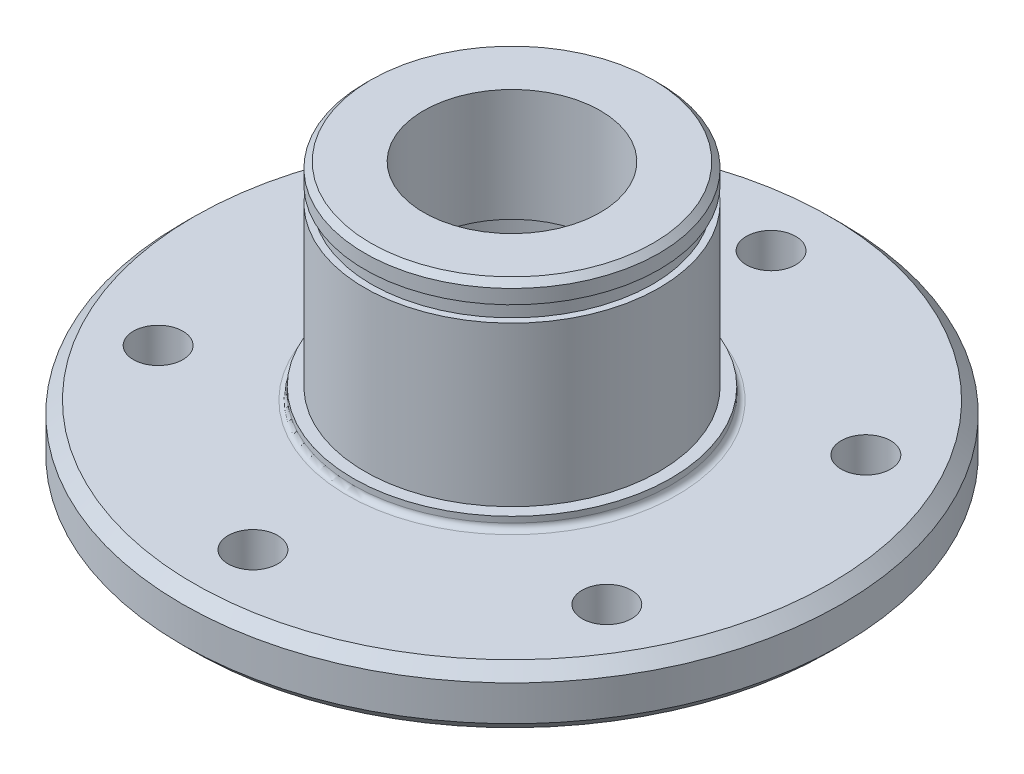
ISO-10303-21;
HEADER;
FILE_DESCRIPTION(('STEP AP214'),'2;1');
FILE_NAME('part.step','',(''),(''),'','','');
FILE_SCHEMA(('AUTOMOTIVE_DESIGN { 1 0 10303 214 1 1 1 1 }'));
ENDSEC;
DATA;
#1=APPLICATION_CONTEXT('core data for automotive mechanical design processes');
#2=APPLICATION_PROTOCOL_DEFINITION('international standard','automotive_design',2000,#1);
#3=PRODUCT_CONTEXT('',#1,'mechanical');
#4=PRODUCT('Part','Part','',(#3));
#5=PRODUCT_RELATED_PRODUCT_CATEGORY('part','',(#4));
#6=PRODUCT_DEFINITION_FORMATION('','',#4);
#7=PRODUCT_DEFINITION_CONTEXT('part definition',#1,'design');
#8=PRODUCT_DEFINITION('design','',#6,#7);
#9=PRODUCT_DEFINITION_SHAPE('','',#8);
#10=(LENGTH_UNIT() NAMED_UNIT(*) SI_UNIT(.MILLI.,.METRE.));
#11=(NAMED_UNIT(*) PLANE_ANGLE_UNIT() SI_UNIT($,.RADIAN.));
#12=(NAMED_UNIT(*) SI_UNIT($,.STERADIAN.) SOLID_ANGLE_UNIT());
#13=UNCERTAINTY_MEASURE_WITH_UNIT(LENGTH_MEASURE(1.E-05),#10,'distance_accuracy_value','');
#14=(GEOMETRIC_REPRESENTATION_CONTEXT(3) GLOBAL_UNCERTAINTY_ASSIGNED_CONTEXT((#13)) GLOBAL_UNIT_ASSIGNED_CONTEXT((#10,
#11,#12)) REPRESENTATION_CONTEXT('',''));
#15=CARTESIAN_POINT('',(0.,0.,0.));
#16=DIRECTION('',(0.,0.,1.));
#17=DIRECTION('',(1.,0.,0.));
#18=AXIS2_PLACEMENT_3D('',#15,#16,#17);
#19=CARTESIAN_POINT('',(0.,0.,0.));
#20=DIRECTION('',(0.,1.,0.));
#21=DIRECTION('',(-1.,0.,0.));
#22=AXIS2_PLACEMENT_3D('',#19,#20,#21);
#23=CYLINDRICAL_SURFACE('',#22,28.);
#24=CARTESIAN_POINT('',(0.,3.99999999999958,0.));
#25=DIRECTION('',(0.,1.,0.));
#26=DIRECTION('',(-1.,0.,0.));
#27=AXIS2_PLACEMENT_3D('',#24,#25,#26);
#28=CIRCLE('',#27,28.);
#29=CARTESIAN_POINT('',(-28.,3.99999999999958,0.));
#30=VERTEX_POINT('',#29);
#31=EDGE_CURVE('E59',#30,#30,#28,.F.);
#32=ORIENTED_EDGE('',*,*,#31,.T.);
#33=EDGE_LOOP('',(#32));
#34=FACE_BOUND('',#33,.T.);
#35=CARTESIAN_POINT('',(0.,1.00000000000043,0.));
#36=DIRECTION('',(0.,-1.,0.));
#37=DIRECTION('',(1.,0.,0.));
#38=AXIS2_PLACEMENT_3D('',#35,#36,#37);
#39=CIRCLE('',#38,28.);
#40=CARTESIAN_POINT('',(-28.,1.00000000000043,0.));
#41=VERTEX_POINT('',#40);
#42=EDGE_CURVE('E62',#41,#41,#39,.F.);
#43=ORIENTED_EDGE('',*,*,#42,.T.);
#44=EDGE_LOOP('',(#43));
#45=FACE_BOUND('',#44,.T.);
#46=ADVANCED_FACE('F36',(#34,#45),#23,.T.);
#47=CARTESIAN_POINT('',(28.,0.,0.));
#48=DIRECTION('',(0.,-1.,0.));
#49=DIRECTION('',(1.,0.,0.));
#50=AXIS2_PLACEMENT_3D('',#47,#48,#49);
#51=PLANE('',#50);
#52=CARTESIAN_POINT('',(0.,0.,0.));
#53=DIRECTION('',(0.,-1.,0.));
#54=DIRECTION('',(1.,0.,0.));
#55=AXIS2_PLACEMENT_3D('',#52,#53,#54);
#56=CIRCLE('',#55,26.9999999999996);
#57=CARTESIAN_POINT('',(-26.9999999999996,0.,0.));
#58=VERTEX_POINT('',#57);
#59=EDGE_CURVE('E51',#58,#58,#56,.T.);
#60=ORIENTED_EDGE('',*,*,#59,.T.);
#61=EDGE_LOOP('',(#60));
#62=FACE_BOUND('',#61,.T.);
#63=CARTESIAN_POINT('',(0.,0.,0.));
#64=DIRECTION('',(0.,-1.,0.));
#65=DIRECTION('',(1.,0.,0.));
#66=AXIS2_PLACEMENT_3D('',#63,#64,#65);
#67=CIRCLE('',#66,11.0000000000004);
#68=CARTESIAN_POINT('',(11.0000000000004,0.,0.));
#69=VERTEX_POINT('',#68);
#70=EDGE_CURVE('E56',#69,#69,#67,.F.);
#71=ORIENTED_EDGE('',*,*,#70,.T.);
#72=EDGE_LOOP('',(#71));
#73=FACE_BOUND('',#72,.T.);
#74=CARTESIAN_POINT('',(0.,0.,22.));
#75=DIRECTION('',(0.,-1.,0.));
#76=DIRECTION('',(0.,0.,-1.));
#77=AXIS2_PLACEMENT_3D('',#74,#75,#76);
#78=CIRCLE('',#77,2.1);
#79=CARTESIAN_POINT('',(0.,0.,19.9));
#80=VERTEX_POINT('',#79);
#81=EDGE_CURVE('E79',#80,#80,#78,.T.);
#82=ORIENTED_EDGE('',*,*,#81,.F.);
#83=EDGE_LOOP('',(#82));
#84=FACE_BOUND('',#83,.T.);
#85=CARTESIAN_POINT('',(19.0525588832577,0.,11.));
#86=DIRECTION('',(0.,-1.,0.));
#87=DIRECTION('',(0.,0.,-1.));
#88=AXIS2_PLACEMENT_3D('',#85,#86,#87);
#89=CIRCLE('',#88,2.1);
#90=CARTESIAN_POINT('',(19.0525588832577,0.,8.89999999999996));
#91=VERTEX_POINT('',#90);
#92=EDGE_CURVE('E78',#91,#91,#89,.T.);
#93=ORIENTED_EDGE('',*,*,#92,.F.);
#94=EDGE_LOOP('',(#93));
#95=FACE_BOUND('',#94,.T.);
#96=CARTESIAN_POINT('',(19.0525588832576,0.,-11.0000000000001));
#97=DIRECTION('',(0.,-1.,0.));
#98=DIRECTION('',(0.,0.,-1.));
#99=AXIS2_PLACEMENT_3D('',#96,#97,#98);
#100=CIRCLE('',#99,2.1);
#101=CARTESIAN_POINT('',(19.0525588832576,0.,-13.1000000000001));
#102=VERTEX_POINT('',#101);
#103=EDGE_CURVE('E83',#102,#102,#100,.T.);
#104=ORIENTED_EDGE('',*,*,#103,.F.);
#105=EDGE_LOOP('',(#104));
#106=FACE_BOUND('',#105,.T.);
#107=CARTESIAN_POINT('',(-1.53625178909098E-13,0.,-22.));
#108=DIRECTION('',(0.,-1.,0.));
#109=DIRECTION('',(0.,0.,-1.));
#110=AXIS2_PLACEMENT_3D('',#107,#108,#109);
#111=CIRCLE('',#110,2.1);
#112=CARTESIAN_POINT('',(-1.53625178909098E-13,0.,-24.1));
#113=VERTEX_POINT('',#112);
#114=EDGE_CURVE('E87',#113,#113,#111,.T.);
#115=ORIENTED_EDGE('',*,*,#114,.F.);
#116=EDGE_LOOP('',(#115));
#117=FACE_BOUND('',#116,.T.);
#118=CARTESIAN_POINT('',(-19.0525588832578,0.,-10.9999999999998));
#119=DIRECTION('',(0.,-1.,0.));
#120=DIRECTION('',(0.,0.,-1.));
#121=AXIS2_PLACEMENT_3D('',#118,#119,#120);
#122=CIRCLE('',#121,2.1);
#123=CARTESIAN_POINT('',(-19.0525588832578,0.,-13.0999999999998));
#124=VERTEX_POINT('',#123);
#125=EDGE_CURVE('E91',#124,#124,#122,.T.);
#126=ORIENTED_EDGE('',*,*,#125,.F.);
#127=EDGE_LOOP('',(#126));
#128=FACE_BOUND('',#127,.T.);
#129=CARTESIAN_POINT('',(-19.0525588832575,0.,11.0000000000002));
#130=DIRECTION('',(0.,-1.,0.));
#131=DIRECTION('',(0.,0.,-1.));
#132=AXIS2_PLACEMENT_3D('',#129,#130,#131);
#133=CIRCLE('',#132,2.1);
#134=CARTESIAN_POINT('',(-19.0525588832575,0.,8.90000000000022));
#135=VERTEX_POINT('',#134);
#136=EDGE_CURVE('E112',#135,#135,#133,.T.);
#137=ORIENTED_EDGE('',*,*,#136,.F.);
#138=EDGE_LOOP('',(#137));
#139=FACE_BOUND('',#138,.T.);
#140=ADVANCED_FACE('F156',(#62,#73,#84,#95,#106,#117,#128,#139),#51,.T.);
#141=CARTESIAN_POINT('',(0.,22.55,0.));
#142=DIRECTION('',(0.,1.,0.));
#143=DIRECTION('',(-1.,0.,0.));
#144=AXIS2_PLACEMENT_3D('',#141,#142,#143);
#145=PLANE('',#144);
#146=CARTESIAN_POINT('',(0.,22.55,0.));
#147=DIRECTION('',(0.,1.,0.));
#148=DIRECTION('',(-1.,0.,0.));
#149=AXIS2_PLACEMENT_3D('',#146,#147,#148);
#150=CIRCLE('',#149,12.);
#151=CARTESIAN_POINT('',(-12.,22.55,0.));
#152=VERTEX_POINT('',#151);
#153=EDGE_CURVE('E71',#152,#152,#150,.T.);
#154=ORIENTED_EDGE('',*,*,#153,.T.);
#155=EDGE_LOOP('',(#154));
#156=FACE_BOUND('',#155,.T.);
#157=CARTESIAN_POINT('',(0.,22.55,0.));
#158=DIRECTION('',(0.,-1.,0.));
#159=DIRECTION('',(0.,0.,-1.));
#160=AXIS2_PLACEMENT_3D('',#157,#158,#159);
#161=CIRCLE('',#160,7.49999999999999);
#162=CARTESIAN_POINT('',(0.,22.55,-7.49999999999999));
#163=VERTEX_POINT('',#162);
#164=EDGE_CURVE('E128',#163,#163,#161,.T.);
#165=ORIENTED_EDGE('',*,*,#164,.T.);
#166=EDGE_LOOP('',(#165));
#167=FACE_BOUND('',#166,.T.);
#168=ADVANCED_FACE('F162',(#156,#167),#145,.T.);
#169=CARTESIAN_POINT('',(0.,0.,0.));
#170=DIRECTION('',(0.,1.,0.));
#171=DIRECTION('',(-1.,0.,0.));
#172=AXIS2_PLACEMENT_3D('',#169,#170,#171);
#173=CYLINDRICAL_SURFACE('',#172,12.5);
#174=CARTESIAN_POINT('',(0.,22.05,0.));
#175=DIRECTION('',(0.,1.,0.));
#176=DIRECTION('',(-1.,0.,0.));
#177=AXIS2_PLACEMENT_3D('',#174,#175,#176);
#178=CIRCLE('',#177,12.5);
#179=CARTESIAN_POINT('',(-12.5,22.05,0.));
#180=VERTEX_POINT('',#179);
#181=EDGE_CURVE('E68',#180,#180,#178,.F.);
#182=ORIENTED_EDGE('',*,*,#181,.T.);
#183=EDGE_LOOP('',(#182));
#184=FACE_BOUND('',#183,.T.);
#185=CARTESIAN_POINT('',(0.,20.85,0.));
#186=DIRECTION('',(0.,1.,0.));
#187=DIRECTION('',(-1.,0.,0.));
#188=AXIS2_PLACEMENT_3D('',#185,#186,#187);
#189=CIRCLE('',#188,12.5);
#190=CARTESIAN_POINT('',(-12.5,20.85,0.));
#191=VERTEX_POINT('',#190);
#192=EDGE_CURVE('E74',#191,#191,#189,.T.);
#193=ORIENTED_EDGE('',*,*,#192,.T.);
#194=EDGE_LOOP('',(#193));
#195=FACE_BOUND('',#194,.T.);
#196=ADVANCED_FACE('F236',(#184,#195),#173,.T.);
#197=CARTESIAN_POINT('',(12.5,20.85,0.));
#198=DIRECTION('',(0.,-1.,0.));
#199=DIRECTION('',(1.,0.,0.));
#200=AXIS2_PLACEMENT_3D('',#197,#198,#199);
#201=PLANE('',#200);
#202=CARTESIAN_POINT('',(0.,20.85,0.));
#203=DIRECTION('',(0.,1.,0.));
#204=DIRECTION('',(-1.,0.,0.));
#205=AXIS2_PLACEMENT_3D('',#202,#203,#204);
#206=CIRCLE('',#205,11.95);
#207=CARTESIAN_POINT('',(-11.95,20.85,0.));
#208=VERTEX_POINT('',#207);
#209=EDGE_CURVE('E94',#208,#208,#206,.T.);
#210=ORIENTED_EDGE('',*,*,#209,.T.);
#211=EDGE_LOOP('',(#210));
#212=FACE_BOUND('',#211,.T.);
#213=ORIENTED_EDGE('',*,*,#192,.F.);
#214=EDGE_LOOP('',(#213));
#215=FACE_BOUND('',#214,.T.);
#216=ADVANCED_FACE('F232',(#212,#215),#201,.T.);
#217=CARTESIAN_POINT('',(0.,0.,0.));
#218=DIRECTION('',(0.,1.,0.));
#219=DIRECTION('',(-1.,0.,0.));
#220=AXIS2_PLACEMENT_3D('',#217,#218,#219);
#221=CYLINDRICAL_SURFACE('',#220,11.95);
#222=CARTESIAN_POINT('',(0.,19.5,0.));
#223=DIRECTION('',(0.,1.,0.));
#224=DIRECTION('',(-1.,0.,0.));
#225=AXIS2_PLACEMENT_3D('',#222,#223,#224);
#226=CIRCLE('',#225,11.95);
#227=CARTESIAN_POINT('',(-11.95,19.5,0.));
#228=VERTEX_POINT('',#227);
#229=EDGE_CURVE('E97',#228,#228,#226,.T.);
#230=ORIENTED_EDGE('',*,*,#229,.T.);
#231=EDGE_LOOP('',(#230));
#232=FACE_BOUND('',#231,.T.);
#233=ORIENTED_EDGE('',*,*,#209,.F.);
#234=EDGE_LOOP('',(#233));
#235=FACE_BOUND('',#234,.T.);
#236=ADVANCED_FACE('F228',(#232,#235),#221,.T.);
#237=CARTESIAN_POINT('',(11.95,19.5,0.));
#238=DIRECTION('',(0.,1.,0.));
#239=DIRECTION('',(-1.,0.,0.));
#240=AXIS2_PLACEMENT_3D('',#237,#238,#239);
#241=PLANE('',#240);
#242=CARTESIAN_POINT('',(0.,19.5,0.));
#243=DIRECTION('',(0.,1.,0.));
#244=DIRECTION('',(-1.,0.,0.));
#245=AXIS2_PLACEMENT_3D('',#242,#243,#244);
#246=CIRCLE('',#245,12.5);
#247=CARTESIAN_POINT('',(-12.5,19.5,0.));
#248=VERTEX_POINT('',#247);
#249=EDGE_CURVE('E100',#248,#248,#246,.T.);
#250=ORIENTED_EDGE('',*,*,#249,.T.);
#251=EDGE_LOOP('',(#250));
#252=FACE_BOUND('',#251,.T.);
#253=ORIENTED_EDGE('',*,*,#229,.F.);
#254=EDGE_LOOP('',(#253));
#255=FACE_BOUND('',#254,.T.);
#256=ADVANCED_FACE('F224',(#252,#255),#241,.T.);
#257=CARTESIAN_POINT('',(0.,0.,0.));
#258=DIRECTION('',(0.,1.,0.));
#259=DIRECTION('',(-1.,0.,0.));
#260=AXIS2_PLACEMENT_3D('',#257,#258,#259);
#261=CYLINDRICAL_SURFACE('',#260,12.5);
#262=CARTESIAN_POINT('',(0.,6.,0.));
#263=DIRECTION('',(0.,1.,0.));
#264=DIRECTION('',(-1.,0.,0.));
#265=AXIS2_PLACEMENT_3D('',#262,#263,#264);
#266=CIRCLE('',#265,12.5);
#267=CARTESIAN_POINT('',(-12.5,6.,0.));
#268=VERTEX_POINT('',#267);
#269=EDGE_CURVE('E103',#268,#268,#266,.T.);
#270=ORIENTED_EDGE('',*,*,#269,.T.);
#271=EDGE_LOOP('',(#270));
#272=FACE_BOUND('',#271,.T.);
#273=ORIENTED_EDGE('',*,*,#249,.F.);
#274=EDGE_LOOP('',(#273));
#275=FACE_BOUND('',#274,.T.);
#276=ADVANCED_FACE('F220',(#272,#275),#261,.T.);
#277=CARTESIAN_POINT('',(12.5,6.,0.));
#278=DIRECTION('',(0.,1.,0.));
#279=DIRECTION('',(-1.,0.,0.));
#280=AXIS2_PLACEMENT_3D('',#277,#278,#279);
#281=PLANE('',#280);
#282=CARTESIAN_POINT('',(0.,6.,0.));
#283=DIRECTION('',(0.,1.,0.));
#284=DIRECTION('',(-1.,0.,0.));
#285=AXIS2_PLACEMENT_3D('',#282,#283,#284);
#286=CIRCLE('',#285,13.5);
#287=CARTESIAN_POINT('',(-13.5,6.,0.));
#288=VERTEX_POINT('',#287);
#289=EDGE_CURVE('E106',#288,#288,#286,.T.);
#290=ORIENTED_EDGE('',*,*,#289,.T.);
#291=EDGE_LOOP('',(#290));
#292=FACE_BOUND('',#291,.T.);
#293=ORIENTED_EDGE('',*,*,#269,.F.);
#294=EDGE_LOOP('',(#293));
#295=FACE_BOUND('',#294,.T.);
#296=ADVANCED_FACE('F217',(#292,#295),#281,.T.);
#297=CARTESIAN_POINT('',(0.,0.,0.));
#298=DIRECTION('',(0.,1.,0.));
#299=DIRECTION('',(-1.,0.,0.));
#300=AXIS2_PLACEMENT_3D('',#297,#298,#299);
#301=CYLINDRICAL_SURFACE('',#300,13.5);
#302=CARTESIAN_POINT('',(0.,5.5,0.));
#303=DIRECTION('',(0.,1.,0.));
#304=DIRECTION('',(-1.,0.,0.));
#305=AXIS2_PLACEMENT_3D('',#302,#303,#304);
#306=CIRCLE('',#305,13.5);
#307=CARTESIAN_POINT('',(-13.5,5.5,0.));
#308=VERTEX_POINT('',#307);
#309=EDGE_CURVE('E43',#308,#308,#306,.T.);
#310=ORIENTED_EDGE('',*,*,#309,.T.);
#311=EDGE_LOOP('',(#310));
#312=FACE_BOUND('',#311,.T.);
#313=ORIENTED_EDGE('',*,*,#289,.F.);
#314=EDGE_LOOP('',(#313));
#315=FACE_BOUND('',#314,.T.);
#316=ADVANCED_FACE('F211',(#312,#315),#301,.T.);
#317=CARTESIAN_POINT('',(13.5,5.,0.));
#318=DIRECTION('',(0.,1.,0.));
#319=DIRECTION('',(-1.,0.,0.));
#320=AXIS2_PLACEMENT_3D('',#317,#318,#319);
#321=PLANE('',#320);
#322=CARTESIAN_POINT('',(0.,5.,0.));
#323=DIRECTION('',(0.,1.,0.));
#324=DIRECTION('',(-1.,0.,0.));
#325=AXIS2_PLACEMENT_3D('',#322,#323,#324);
#326=CIRCLE('',#325,14.);
#327=CARTESIAN_POINT('',(-14.,5.,0.));
#328=VERTEX_POINT('',#327);
#329=EDGE_CURVE('E10',#328,#328,#326,.F.);
#330=ORIENTED_EDGE('',*,*,#329,.T.);
#331=EDGE_LOOP('',(#330));
#332=FACE_BOUND('',#331,.T.);
#333=CARTESIAN_POINT('',(0.,5.,0.));
#334=DIRECTION('',(0.,1.,0.));
#335=DIRECTION('',(-1.,0.,0.));
#336=AXIS2_PLACEMENT_3D('',#333,#334,#335);
#337=CIRCLE('',#336,26.9999999999996);
#338=CARTESIAN_POINT('',(-26.9999999999996,5.,0.));
#339=VERTEX_POINT('',#338);
#340=EDGE_CURVE('E65',#339,#339,#337,.T.);
#341=ORIENTED_EDGE('',*,*,#340,.T.);
#342=EDGE_LOOP('',(#341));
#343=FACE_BOUND('',#342,.T.);
#344=CARTESIAN_POINT('',(0.,5.,22.));
#345=DIRECTION('',(0.,1.,0.));
#346=DIRECTION('',(-1.,0.,0.));
#347=AXIS2_PLACEMENT_3D('',#344,#345,#346);
#348=CIRCLE('',#347,2.1);
#349=CARTESIAN_POINT('',(-2.1,5.,22.));
#350=VERTEX_POINT('',#349);
#351=EDGE_CURVE('E75',#350,#350,#348,.T.);
#352=ORIENTED_EDGE('',*,*,#351,.F.);
#353=EDGE_LOOP('',(#352));
#354=FACE_BOUND('',#353,.T.);
#355=CARTESIAN_POINT('',(19.0525588832577,5.,11.));
#356=DIRECTION('',(0.,1.,0.));
#357=DIRECTION('',(-1.,0.,0.));
#358=AXIS2_PLACEMENT_3D('',#355,#356,#357);
#359=CIRCLE('',#358,2.1);
#360=CARTESIAN_POINT('',(16.9525588832577,5.,11.));
#361=VERTEX_POINT('',#360);
#362=EDGE_CURVE('E80',#361,#361,#359,.T.);
#363=ORIENTED_EDGE('',*,*,#362,.F.);
#364=EDGE_LOOP('',(#363));
#365=FACE_BOUND('',#364,.T.);
#366=CARTESIAN_POINT('',(19.0525588832576,5.,-11.0000000000001));
#367=DIRECTION('',(0.,1.,0.));
#368=DIRECTION('',(-1.,0.,0.));
#369=AXIS2_PLACEMENT_3D('',#366,#367,#368);
#370=CIRCLE('',#369,2.1);
#371=CARTESIAN_POINT('',(16.9525588832576,5.,-11.0000000000001));
#372=VERTEX_POINT('',#371);
#373=EDGE_CURVE('E84',#372,#372,#370,.T.);
#374=ORIENTED_EDGE('',*,*,#373,.F.);
#375=EDGE_LOOP('',(#374));
#376=FACE_BOUND('',#375,.T.);
#377=CARTESIAN_POINT('',(-1.53625178909098E-13,5.,-22.));
#378=DIRECTION('',(0.,1.,0.));
#379=DIRECTION('',(-1.,0.,0.));
#380=AXIS2_PLACEMENT_3D('',#377,#378,#379);
#381=CIRCLE('',#380,2.1);
#382=CARTESIAN_POINT('',(-2.10000000000015,5.,-22.));
#383=VERTEX_POINT('',#382);
#384=EDGE_CURVE('E88',#383,#383,#381,.T.);
#385=ORIENTED_EDGE('',*,*,#384,.F.);
#386=EDGE_LOOP('',(#385));
#387=FACE_BOUND('',#386,.T.);
#388=CARTESIAN_POINT('',(-19.0525588832578,5.,-10.9999999999998));
#389=DIRECTION('',(0.,1.,0.));
#390=DIRECTION('',(-1.,0.,0.));
#391=AXIS2_PLACEMENT_3D('',#388,#389,#390);
#392=CIRCLE('',#391,2.1);
#393=CARTESIAN_POINT('',(-21.1525588832577,5.,-10.9999999999998));
#394=VERTEX_POINT('',#393);
#395=EDGE_CURVE('E115',#394,#394,#392,.T.);
#396=ORIENTED_EDGE('',*,*,#395,.F.);
#397=EDGE_LOOP('',(#396));
#398=FACE_BOUND('',#397,.T.);
#399=CARTESIAN_POINT('',(-19.0525588832575,5.,11.0000000000002));
#400=DIRECTION('',(0.,1.,0.));
#401=DIRECTION('',(-1.,0.,0.));
#402=AXIS2_PLACEMENT_3D('',#399,#400,#401);
#403=CIRCLE('',#402,2.1);
#404=CARTESIAN_POINT('',(-21.1525588832575,5.,11.0000000000002));
#405=VERTEX_POINT('',#404);
#406=EDGE_CURVE('E109',#405,#405,#403,.T.);
#407=ORIENTED_EDGE('',*,*,#406,.F.);
#408=EDGE_LOOP('',(#407));
#409=FACE_BOUND('',#408,.T.);
#410=ADVANCED_FACE('F201',(#332,#343,#354,#365,#376,#387,#398,#409),#321,.T.);
#411=CARTESIAN_POINT('',(-19.0525588832575,0.,11.0000000000002));
#412=DIRECTION('',(0.,-1.,0.));
#413=DIRECTION('',(0.,0.,-1.));
#414=AXIS2_PLACEMENT_3D('',#411,#412,#413);
#415=CYLINDRICAL_SURFACE('',#414,2.1);
#416=ORIENTED_EDGE('',*,*,#406,.T.);
#417=EDGE_LOOP('',(#416));
#418=FACE_BOUND('',#417,.T.);
#419=ORIENTED_EDGE('',*,*,#136,.T.);
#420=EDGE_LOOP('',(#419));
#421=FACE_BOUND('',#420,.T.);
#422=ADVANCED_FACE('F198',(#418,#421),#415,.F.);
#423=CARTESIAN_POINT('',(-19.0525588832578,0.,-10.9999999999998));
#424=DIRECTION('',(0.,-1.,0.));
#425=DIRECTION('',(0.,0.,-1.));
#426=AXIS2_PLACEMENT_3D('',#423,#424,#425);
#427=CYLINDRICAL_SURFACE('',#426,2.1);
#428=ORIENTED_EDGE('',*,*,#395,.T.);
#429=EDGE_LOOP('',(#428));
#430=FACE_BOUND('',#429,.T.);
#431=ORIENTED_EDGE('',*,*,#125,.T.);
#432=EDGE_LOOP('',(#431));
#433=FACE_BOUND('',#432,.T.);
#434=ADVANCED_FACE('F200',(#430,#433),#427,.F.);
#435=CARTESIAN_POINT('',(-1.53625178909098E-13,0.,-22.));
#436=DIRECTION('',(0.,-1.,0.));
#437=DIRECTION('',(0.,0.,-1.));
#438=AXIS2_PLACEMENT_3D('',#435,#436,#437);
#439=CYLINDRICAL_SURFACE('',#438,2.1);
#440=ORIENTED_EDGE('',*,*,#384,.T.);
#441=EDGE_LOOP('',(#440));
#442=FACE_BOUND('',#441,.T.);
#443=ORIENTED_EDGE('',*,*,#114,.T.);
#444=EDGE_LOOP('',(#443));
#445=FACE_BOUND('',#444,.T.);
#446=ADVANCED_FACE('F208',(#442,#445),#439,.F.);
#447=CARTESIAN_POINT('',(19.0525588832576,0.,-11.0000000000001));
#448=DIRECTION('',(0.,-1.,0.));
#449=DIRECTION('',(0.,0.,-1.));
#450=AXIS2_PLACEMENT_3D('',#447,#448,#449);
#451=CYLINDRICAL_SURFACE('',#450,2.1);
#452=ORIENTED_EDGE('',*,*,#373,.T.);
#453=EDGE_LOOP('',(#452));
#454=FACE_BOUND('',#453,.T.);
#455=ORIENTED_EDGE('',*,*,#103,.T.);
#456=EDGE_LOOP('',(#455));
#457=FACE_BOUND('',#456,.T.);
#458=ADVANCED_FACE('F262',(#454,#457),#451,.F.);
#459=CARTESIAN_POINT('',(19.0525588832577,0.,11.));
#460=DIRECTION('',(0.,-1.,0.));
#461=DIRECTION('',(0.,0.,-1.));
#462=AXIS2_PLACEMENT_3D('',#459,#460,#461);
#463=CYLINDRICAL_SURFACE('',#462,2.1);
#464=ORIENTED_EDGE('',*,*,#362,.T.);
#465=EDGE_LOOP('',(#464));
#466=FACE_BOUND('',#465,.T.);
#467=ORIENTED_EDGE('',*,*,#92,.T.);
#468=EDGE_LOOP('',(#467));
#469=FACE_BOUND('',#468,.T.);
#470=ADVANCED_FACE('F256',(#466,#469),#463,.F.);
#471=CARTESIAN_POINT('',(0.,0.,22.));
#472=DIRECTION('',(0.,-1.,0.));
#473=DIRECTION('',(0.,0.,-1.));
#474=AXIS2_PLACEMENT_3D('',#471,#472,#473);
#475=CYLINDRICAL_SURFACE('',#474,2.1);
#476=ORIENTED_EDGE('',*,*,#351,.T.);
#477=EDGE_LOOP('',(#476));
#478=FACE_BOUND('',#477,.T.);
#479=ORIENTED_EDGE('',*,*,#81,.T.);
#480=EDGE_LOOP('',(#479));
#481=FACE_BOUND('',#480,.T.);
#482=ADVANCED_FACE('F250',(#478,#481),#475,.F.);
#483=CARTESIAN_POINT('',(0.,0.,0.));
#484=DIRECTION('',(0.,-1.,0.));
#485=DIRECTION('',(0.,0.,-1.));
#486=AXIS2_PLACEMENT_3D('',#483,#484,#485);
#487=CYLINDRICAL_SURFACE('',#486,7.5);
#488=ORIENTED_EDGE('',*,*,#164,.F.);
#489=EDGE_LOOP('',(#488));
#490=FACE_BOUND('',#489,.T.);
#491=CARTESIAN_POINT('',(0.,13.,0.));
#492=DIRECTION('',(0.,-1.,0.));
#493=DIRECTION('',(0.,0.,-1.));
#494=AXIS2_PLACEMENT_3D('',#491,#492,#493);
#495=CIRCLE('',#494,7.5);
#496=CARTESIAN_POINT('',(0.,13.,-7.5));
#497=VERTEX_POINT('',#496);
#498=EDGE_CURVE('E131',#497,#497,#495,.T.);
#499=ORIENTED_EDGE('',*,*,#498,.T.);
#500=EDGE_LOOP('',(#499));
#501=FACE_BOUND('',#500,.T.);
#502=ADVANCED_FACE('F152',(#490,#501),#487,.F.);
#503=CARTESIAN_POINT('',(7.5,13.,0.));
#504=DIRECTION('',(0.,1.,0.));
#505=DIRECTION('',(0.,0.,1.));
#506=AXIS2_PLACEMENT_3D('',#503,#504,#505);
#507=PLANE('',#506);
#508=ORIENTED_EDGE('',*,*,#498,.F.);
#509=EDGE_LOOP('',(#508));
#510=FACE_BOUND('',#509,.T.);
#511=CARTESIAN_POINT('',(0.,13.,0.));
#512=DIRECTION('',(0.,-1.,0.));
#513=DIRECTION('',(0.,0.,-1.));
#514=AXIS2_PLACEMENT_3D('',#511,#512,#513);
#515=CIRCLE('',#514,10.);
#516=CARTESIAN_POINT('',(0.,13.,-10.));
#517=VERTEX_POINT('',#516);
#518=EDGE_CURVE('E134',#517,#517,#515,.T.);
#519=ORIENTED_EDGE('',*,*,#518,.T.);
#520=EDGE_LOOP('',(#519));
#521=FACE_BOUND('',#520,.T.);
#522=ADVANCED_FACE('F138',(#510,#521),#507,.F.);
#523=CARTESIAN_POINT('',(0.,0.,0.));
#524=DIRECTION('',(0.,-1.,0.));
#525=DIRECTION('',(0.,0.,-1.));
#526=AXIS2_PLACEMENT_3D('',#523,#524,#525);
#527=CYLINDRICAL_SURFACE('',#526,10.);
#528=CARTESIAN_POINT('',(0.,1.00000000000041,0.));
#529=DIRECTION('',(0.,-1.,0.));
#530=DIRECTION('',(0.,0.,-1.));
#531=AXIS2_PLACEMENT_3D('',#528,#529,#530);
#532=CIRCLE('',#531,10.);
#533=CARTESIAN_POINT('',(0.,1.00000000000041,-10.));
#534=VERTEX_POINT('',#533);
#535=EDGE_CURVE('E47',#534,#534,#532,.T.);
#536=ORIENTED_EDGE('',*,*,#535,.T.);
#537=EDGE_LOOP('',(#536));
#538=FACE_BOUND('',#537,.T.);
#539=ORIENTED_EDGE('',*,*,#518,.F.);
#540=EDGE_LOOP('',(#539));
#541=FACE_BOUND('',#540,.T.);
#542=ADVANCED_FACE('F140',(#538,#541),#527,.F.);
#543=CARTESIAN_POINT('',(0.,22.55,0.));
#544=DIRECTION('',(0.,-1.,0.));
#545=DIRECTION('',(1.,0.,0.));
#546=AXIS2_PLACEMENT_3D('',#543,#544,#545);
#547=CONICAL_SURFACE('',#546,12.,0.785398163397438);
#548=ORIENTED_EDGE('',*,*,#181,.F.);
#549=EDGE_LOOP('',(#548));
#550=FACE_BOUND('',#549,.T.);
#551=ORIENTED_EDGE('',*,*,#153,.F.);
#552=EDGE_LOOP('',(#551));
#553=FACE_BOUND('',#552,.T.);
#554=ADVANCED_FACE('F142',(#550,#553),#547,.T.);
#555=CARTESIAN_POINT('',(0.,5.,0.));
#556=DIRECTION('',(0.,-1.,0.));
#557=DIRECTION('',(1.,0.,0.));
#558=AXIS2_PLACEMENT_3D('',#555,#556,#557);
#559=CONICAL_SURFACE('',#558,26.9999999999996,0.785398163397447);
#560=ORIENTED_EDGE('',*,*,#31,.F.);
#561=EDGE_LOOP('',(#560));
#562=FACE_BOUND('',#561,.T.);
#563=ORIENTED_EDGE('',*,*,#340,.F.);
#564=EDGE_LOOP('',(#563));
#565=FACE_BOUND('',#564,.T.);
#566=ADVANCED_FACE('F149',(#562,#565),#559,.T.);
#567=CARTESIAN_POINT('',(0.,1.00000000000043,0.));
#568=DIRECTION('',(0.,1.,0.));
#569=DIRECTION('',(-1.,0.,0.));
#570=AXIS2_PLACEMENT_3D('',#567,#568,#569);
#571=CONICAL_SURFACE('',#570,28.,0.785398163397452);
#572=CARTESIAN_POINT('',(-26.9999999999996,0.,0.));
#573=CARTESIAN_POINT('',(-27.0104166666662,0.0104166666666714,0.));
#574=CARTESIAN_POINT('',(-27.0208333333329,0.0208333333333425,0.));
#575=CARTESIAN_POINT('',(-27.0416666666662,0.0416666666666849,0.));
#576=CARTESIAN_POINT('',(-27.0520833333329,0.0520833333333561,0.));
#577=CARTESIAN_POINT('',(-27.0729166666663,0.0729166666666985,0.));
#578=CARTESIAN_POINT('',(-27.0833333333329,0.0833333333333696,0.));
#579=CARTESIAN_POINT('',(-27.1041666666663,0.104166666666712,0.));
#580=CARTESIAN_POINT('',(-27.1145833333329,0.114583333333383,0.));
#581=CARTESIAN_POINT('',(-27.1354166666663,0.135416666666726,0.));
#582=CARTESIAN_POINT('',(-27.145833333333,0.145833333333397,0.));
#583=CARTESIAN_POINT('',(-27.1666666666663,0.166666666666739,0.));
#584=CARTESIAN_POINT('',(-27.177083333333,0.17708333333341,0.));
#585=CARTESIAN_POINT('',(-27.1979166666663,0.197916666666753,0.));
#586=CARTESIAN_POINT('',(-27.208333333333,0.208333333333424,0.));
#587=CARTESIAN_POINT('',(-27.2291666666663,0.229166666666766,0.));
#588=CARTESIAN_POINT('',(-27.239583333333,0.239583333333438,0.));
#589=CARTESIAN_POINT('',(-27.2604166666663,0.26041666666678,0.));
#590=CARTESIAN_POINT('',(-27.270833333333,0.270833333333451,0.));
#591=CARTESIAN_POINT('',(-27.2916666666664,0.291666666666794,0.));
#592=CARTESIAN_POINT('',(-27.302083333333,0.302083333333465,0.));
#593=CARTESIAN_POINT('',(-27.3229166666664,0.322916666666807,0.));
#594=CARTESIAN_POINT('',(-27.333333333333,0.333333333333478,0.));
#595=CARTESIAN_POINT('',(-27.3541666666664,0.354166666666821,0.));
#596=CARTESIAN_POINT('',(-27.3645833333331,0.364583333333492,0.));
#597=CARTESIAN_POINT('',(-27.3854166666664,0.385416666666834,0.));
#598=CARTESIAN_POINT('',(-27.3958333333331,0.395833333333505,0.));
#599=CARTESIAN_POINT('',(-27.4166666666664,0.416666666666848,0.));
#600=CARTESIAN_POINT('',(-27.4270833333331,0.427083333333519,0.));
#601=CARTESIAN_POINT('',(-27.4479166666664,0.447916666666861,0.));
#602=CARTESIAN_POINT('',(-27.4583333333331,0.458333333333532,0.));
#603=CARTESIAN_POINT('',(-27.4791666666664,0.479166666666875,0.));
#604=CARTESIAN_POINT('',(-27.4895833333331,0.489583333333546,0.));
#605=CARTESIAN_POINT('',(-27.5104166666664,0.510416666666889,0.));
#606=CARTESIAN_POINT('',(-27.5208333333331,0.52083333333356,0.));
#607=CARTESIAN_POINT('',(-27.5416666666665,0.541666666666902,0.));
#608=CARTESIAN_POINT('',(-27.5520833333331,0.552083333333573,0.));
#609=CARTESIAN_POINT('',(-27.5729166666665,0.572916666666916,0.));
#610=CARTESIAN_POINT('',(-27.5833333333331,0.583333333333587,0.));
#611=CARTESIAN_POINT('',(-27.6041666666665,0.604166666666929,0.));
#612=CARTESIAN_POINT('',(-27.6145833333332,0.6145833333336,0.));
#613=CARTESIAN_POINT('',(-27.6354166666665,0.635416666666943,0.));
#614=CARTESIAN_POINT('',(-27.6458333333332,0.645833333333614,0.));
#615=CARTESIAN_POINT('',(-27.6666666666665,0.666666666666956,0.));
#616=CARTESIAN_POINT('',(-27.6770833333332,0.677083333333628,0.));
#617=CARTESIAN_POINT('',(-27.6979166666665,0.69791666666697,0.));
#618=CARTESIAN_POINT('',(-27.7083333333332,0.708333333333641,0.));
#619=CARTESIAN_POINT('',(-27.7291666666665,0.729166666666984,0.));
#620=CARTESIAN_POINT('',(-27.7395833333332,0.739583333333655,0.));
#621=CARTESIAN_POINT('',(-27.7604166666666,0.760416666666997,0.));
#622=CARTESIAN_POINT('',(-27.7708333333332,0.770833333333668,0.));
#623=CARTESIAN_POINT('',(-27.7916666666666,0.791666666667011,0.));
#624=CARTESIAN_POINT('',(-27.8020833333332,0.802083333333682,0.));
#625=CARTESIAN_POINT('',(-27.8229166666666,0.822916666667024,0.));
#626=CARTESIAN_POINT('',(-27.8333333333333,0.833333333333696,0.));
#627=CARTESIAN_POINT('',(-27.8541666666666,0.854166666667038,0.));
#628=CARTESIAN_POINT('',(-27.8645833333333,0.864583333333709,0.));
#629=CARTESIAN_POINT('',(-27.8854166666666,0.885416666667051,0.));
#630=CARTESIAN_POINT('',(-27.8958333333333,0.895833333333723,0.));
#631=CARTESIAN_POINT('',(-27.9166666666666,0.916666666667065,0.));
#632=CARTESIAN_POINT('',(-27.9270833333333,0.927083333333736,0.));
#633=CARTESIAN_POINT('',(-27.9479166666666,0.947916666667079,0.));
#634=CARTESIAN_POINT('',(-27.9583333333333,0.95833333333375,0.));
#635=CARTESIAN_POINT('',(-27.9791666666667,0.979166666667092,0.));
#636=CARTESIAN_POINT('',(-27.9895833333333,0.989583333333763,0.));
#637=CARTESIAN_POINT('',(-28.,1.00000000000043,0.));
#638=B_SPLINE_CURVE_WITH_KNOTS('',3,(#572,#573,#574,#575,#576,#577,#578,#579,#580,#581,#582,
#583,#584,#585,#586,#587,#588,#589,#590,#591,#592,#593,#594,#595,#596,#597,#598,#599,#600,#601,
#602,#603,#604,#605,#606,#607,#608,#609,#610,#611,#612,#613,#614,#615,#616,#617,#618,#619,#620,
#621,#622,#623,#624,#625,#626,#627,#628,#629,#630,#631,#632,#633,#634,#635,#636,#637),
.UNSPECIFIED.,.F.,.F.,(4,2,2,2,2,2,2,2,2,2,2,2,2,2,2,2,2,2,2,2,2,2,2,2,2,2,2,2,2,2,2,2,4),(0.,
0.0441941738241786,0.0883883476483572,0.132582521472536,0.176776695296715,0.220970869120893,
0.265165042945072,0.30935921676925,0.353553390593429,0.397747564417608,0.441941738241786,
0.486135912065965,0.530330085890144,0.574524259714322,0.618718433538501,0.66291260736268,
0.707106781186856,0.751300955011035,0.795495128835213,0.839689302659392,0.88388347648357,
0.928077650307749,0.972271824131928,1.01646599795611,1.06066017178029,1.10485434560446,
1.14904851942864,1.19324269325282,1.237436867077,1.28163104090118,1.32582521472536,
1.37001938854954,1.41421356237371),.UNSPECIFIED.);
#639=EDGE_CURVE('BSEAM170',#58,#41,#638,.T.);
#640=ORIENTED_EDGE('',*,*,#59,.F.);
#641=ORIENTED_EDGE('',*,*,#42,.F.);
#642=ORIENTED_EDGE('',*,*,#639,.T.);
#643=ORIENTED_EDGE('',*,*,#639,.F.);
#644=EDGE_LOOP('',(#640,#642,#641,#643));
#645=FACE_BOUND('',#644,.T.);
#646=ADVANCED_FACE('F170',(#645),#571,.T.);
#647=CARTESIAN_POINT('',(0.,1.00000000000041,0.));
#648=DIRECTION('',(0.,-1.,0.));
#649=DIRECTION('',(0.,0.,-1.));
#650=AXIS2_PLACEMENT_3D('',#647,#648,#649);
#651=CONICAL_SURFACE('',#650,10.,0.785398163397451);
#652=ORIENTED_EDGE('',*,*,#70,.F.);
#653=EDGE_LOOP('',(#652));
#654=FACE_BOUND('',#653,.T.);
#655=ORIENTED_EDGE('',*,*,#535,.F.);
#656=EDGE_LOOP('',(#655));
#657=FACE_BOUND('',#656,.T.);
#658=ADVANCED_FACE('F173',(#654,#657),#651,.F.);
#659=CARTESIAN_POINT('',(0.,5.5,0.));
#660=DIRECTION('',(0.,1.,0.));
#661=DIRECTION('',(-1.,0.,0.));
#662=AXIS2_PLACEMENT_3D('',#659,#660,#661);
#663=TOROIDAL_SURFACE('',#662,14.,0.5);
#664=ORIENTED_EDGE('',*,*,#329,.F.);
#665=EDGE_LOOP('',(#664));
#666=FACE_BOUND('',#665,.T.);
#667=ORIENTED_EDGE('',*,*,#309,.F.);
#668=EDGE_LOOP('',(#667));
#669=FACE_BOUND('',#668,.T.);
#670=ADVANCED_FACE('F38',(#666,#669),#663,.F.);
#671=CLOSED_SHELL('',(#46,#140,#168,#196,#216,#236,#256,#276,#296,#316,#410,#422,#434,#446,#458,
#470,#482,#502,#522,#542,#554,#566,#646,#658,#670));
#672=MANIFOLD_SOLID_BREP('B2',#671);
#673=ADVANCED_BREP_SHAPE_REPRESENTATION('',(#18,#672),#14);
#674=SHAPE_DEFINITION_REPRESENTATION(#9,#673);
ENDSEC;
END-ISO-10303-21;
